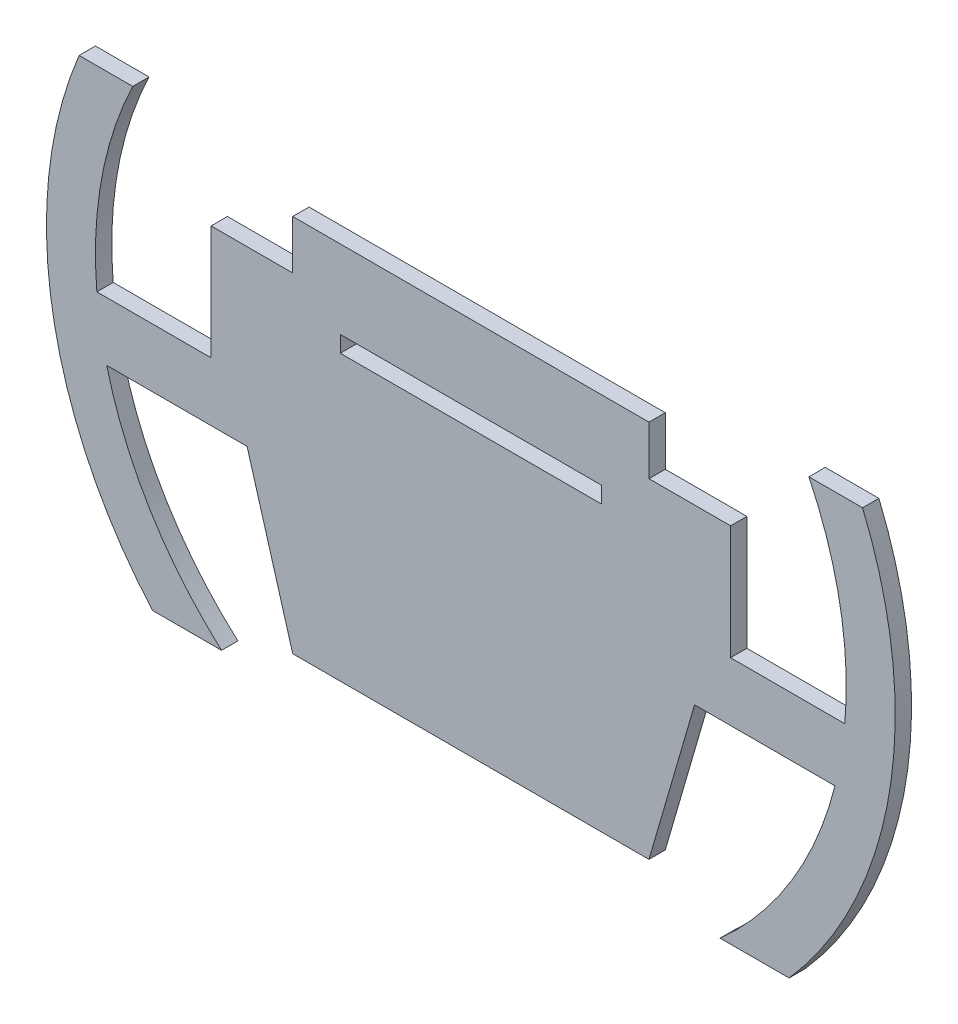
ISO-10303-21;
HEADER;
FILE_DESCRIPTION(('STEP AP214'),'2;1');
FILE_NAME('part.step','',(''),(''),'','','');
FILE_SCHEMA(('AUTOMOTIVE_DESIGN { 1 0 10303 214 1 1 1 1 }'));
ENDSEC;
DATA;
#1=APPLICATION_CONTEXT('core data for automotive mechanical design processes');
#2=APPLICATION_PROTOCOL_DEFINITION('international standard','automotive_design',2000,#1);
#3=PRODUCT_CONTEXT('',#1,'mechanical');
#4=PRODUCT('Part','Part','',(#3));
#5=PRODUCT_RELATED_PRODUCT_CATEGORY('part','',(#4));
#6=PRODUCT_DEFINITION_FORMATION('','',#4);
#7=PRODUCT_DEFINITION_CONTEXT('part definition',#1,'design');
#8=PRODUCT_DEFINITION('design','',#6,#7);
#9=PRODUCT_DEFINITION_SHAPE('','',#8);
#10=(LENGTH_UNIT() NAMED_UNIT(*) SI_UNIT(.MILLI.,.METRE.));
#11=(NAMED_UNIT(*) PLANE_ANGLE_UNIT() SI_UNIT($,.RADIAN.));
#12=(NAMED_UNIT(*) SI_UNIT($,.STERADIAN.) SOLID_ANGLE_UNIT());
#13=UNCERTAINTY_MEASURE_WITH_UNIT(LENGTH_MEASURE(1.E-05),#10,'distance_accuracy_value','');
#14=(GEOMETRIC_REPRESENTATION_CONTEXT(3) GLOBAL_UNCERTAINTY_ASSIGNED_CONTEXT((#13)) GLOBAL_UNIT_ASSIGNED_CONTEXT((#10,
#11,#12)) REPRESENTATION_CONTEXT('',''));
#15=CARTESIAN_POINT('',(0.,0.,0.));
#16=DIRECTION('',(0.,0.,1.));
#17=DIRECTION('',(1.,0.,0.));
#18=AXIS2_PLACEMENT_3D('',#15,#16,#17);
#19=CARTESIAN_POINT('',(0.,0.,5.));
#20=DIRECTION('',(0.,0.,1.));
#21=DIRECTION('',(1.,0.,0.));
#22=AXIS2_PLACEMENT_3D('',#19,#20,#21);
#23=PLANE('',#22);
#24=DIRECTION('',(0.,1.,0.));
#25=VECTOR('',#24,1.);
#26=CARTESIAN_POINT('',(40.,16.,5.));
#27=LINE('',#26,#25);
#28=CARTESIAN_POINT('',(40.,11.,5.));
#29=VERTEX_POINT('',#28);
#30=CARTESIAN_POINT('',(40.,16.,5.));
#31=VERTEX_POINT('',#30);
#32=EDGE_CURVE('E53',#29,#31,#27,.T.);
#33=ORIENTED_EDGE('',*,*,#32,.F.);
#34=DIRECTION('',(1.,0.,0.));
#35=VECTOR('',#34,1.);
#36=CARTESIAN_POINT('',(-40.,11.,5.));
#37=LINE('',#36,#35);
#38=CARTESIAN_POINT('',(-40.,11.,5.));
#39=VERTEX_POINT('',#38);
#40=EDGE_CURVE('E240',#39,#29,#37,.T.);
#41=ORIENTED_EDGE('',*,*,#40,.F.);
#42=DIRECTION('',(0.,-1.,0.));
#43=VECTOR('',#42,1.);
#44=CARTESIAN_POINT('',(-40.,16.,5.));
#45=LINE('',#44,#43);
#46=CARTESIAN_POINT('',(-40.,16.,5.));
#47=VERTEX_POINT('',#46);
#48=EDGE_CURVE('E243',#47,#39,#45,.T.);
#49=ORIENTED_EDGE('',*,*,#48,.F.);
#50=DIRECTION('',(-1.,0.,0.));
#51=VECTOR('',#50,1.);
#52=CARTESIAN_POINT('',(-40.,16.,5.));
#53=LINE('',#52,#51);
#54=EDGE_CURVE('E249',#31,#47,#53,.T.);
#55=ORIENTED_EDGE('',*,*,#54,.F.);
#56=EDGE_LOOP('',(#33,#41,#49,#55));
#57=FACE_BOUND('',#56,.T.);
#58=DIRECTION('',(0.,1.,0.));
#59=VECTOR('',#58,1.);
#60=CARTESIAN_POINT('',(-79.564392373896,-10.,5.));
#61=LINE('',#60,#59);
#62=CARTESIAN_POINT('',(-79.564392373896,-10.,5.));
#63=VERTEX_POINT('',#62);
#64=CARTESIAN_POINT('',(-79.564392373896,25.,5.));
#65=VERTEX_POINT('',#64);
#66=EDGE_CURVE('E263',#63,#65,#61,.T.);
#67=ORIENTED_EDGE('',*,*,#66,.F.);
#68=DIRECTION('',(1.,0.,0.));
#69=VECTOR('',#68,1.);
#70=CARTESIAN_POINT('',(0.,-10.,5.));
#71=LINE('',#70,#69);
#72=CARTESIAN_POINT('',(-114.564392373896,-10.,5.));
#73=VERTEX_POINT('',#72);
#74=EDGE_CURVE('E323',#73,#63,#71,.T.);
#75=ORIENTED_EDGE('',*,*,#74,.F.);
#76=CARTESIAN_POINT('',(0.,0.,5.));
#77=DIRECTION('',(0.,0.,1.));
#78=DIRECTION('',(1.,0.,0.));
#79=AXIS2_PLACEMENT_3D('',#76,#77,#78);
#80=CIRCLE('',#79,115.);
#81=CARTESIAN_POINT('',(-103.56157588604,50.,5.));
#82=VERTEX_POINT('',#81);
#83=EDGE_CURVE('E325',#82,#73,#80,.T.);
#84=ORIENTED_EDGE('',*,*,#83,.F.);
#85=DIRECTION('',(-1.,0.,0.));
#86=VECTOR('',#85,1.);
#87=CARTESIAN_POINT('',(0.,50.,5.));
#88=LINE('',#87,#86);
#89=CARTESIAN_POINT('',(-120.,50.,5.));
#90=VERTEX_POINT('',#89);
#91=EDGE_CURVE('E328',#82,#90,#88,.T.);
#92=ORIENTED_EDGE('',*,*,#91,.T.);
#93=CARTESIAN_POINT('',(0.,0.,5.));
#94=DIRECTION('',(0.,0.,1.));
#95=DIRECTION('',(1.,0.,0.));
#96=AXIS2_PLACEMENT_3D('',#93,#94,#95);
#97=CIRCLE('',#96,130.);
#98=CARTESIAN_POINT('',(-97.4884608556315,-86.,5.));
#99=VERTEX_POINT('',#98);
#100=EDGE_CURVE('E330',#90,#99,#97,.T.);
#101=ORIENTED_EDGE('',*,*,#100,.T.);
#102=DIRECTION('',(-1.,0.,0.));
#103=VECTOR('',#102,1.);
#104=CARTESIAN_POINT('',(0.,-86.,5.));
#105=LINE('',#104,#103);
#106=CARTESIAN_POINT('',(-76.3478879865056,-86.,5.));
#107=VERTEX_POINT('',#106);
#108=EDGE_CURVE('E332',#107,#99,#105,.T.);
#109=ORIENTED_EDGE('',*,*,#108,.F.);
#110=CARTESIAN_POINT('',(0.,0.,5.));
#111=DIRECTION('',(0.,0.,1.));
#112=DIRECTION('',(1.,0.,0.));
#113=AXIS2_PLACEMENT_3D('',#110,#111,#112);
#114=CIRCLE('',#113,115.);
#115=CARTESIAN_POINT('',(-111.539230766578,-28.,5.));
#116=VERTEX_POINT('',#115);
#117=EDGE_CURVE('E281',#116,#107,#114,.T.);
#118=ORIENTED_EDGE('',*,*,#117,.F.);
#119=DIRECTION('',(1.,0.,0.));
#120=VECTOR('',#119,1.);
#121=CARTESIAN_POINT('',(0.,-28.,5.));
#122=LINE('',#121,#120);
#123=CARTESIAN_POINT('',(-68.5392307665783,-28.,5.));
#124=VERTEX_POINT('',#123);
#125=EDGE_CURVE('E284',#116,#124,#122,.T.);
#126=ORIENTED_EDGE('',*,*,#125,.T.);
#127=DIRECTION('',(0.279536123266532,-0.960135175789908,0.));
#128=VECTOR('',#127,1.);
#129=CARTESIAN_POINT('',(-70.6985338444657,-20.5833455224164,5.));
#130=LINE('',#129,#128);
#131=CARTESIAN_POINT('',(-54.564392373896,-76.,5.));
#132=VERTEX_POINT('',#131);
#133=EDGE_CURVE('E287',#124,#132,#130,.T.);
#134=ORIENTED_EDGE('',*,*,#133,.T.);
#135=DIRECTION('',(1.,0.,0.));
#136=VECTOR('',#135,1.);
#137=CARTESIAN_POINT('',(0.,-76.,5.));
#138=LINE('',#137,#136);
#139=CARTESIAN_POINT('',(54.564392373896,-76.,5.));
#140=VERTEX_POINT('',#139);
#141=EDGE_CURVE('E289',#132,#140,#138,.T.);
#142=ORIENTED_EDGE('',*,*,#141,.T.);
#143=DIRECTION('',(-0.279536123266532,-0.960135175789908,0.));
#144=VECTOR('',#143,1.);
#145=CARTESIAN_POINT('',(70.6985338444657,-20.5833455224164,5.));
#146=LINE('',#145,#144);
#147=CARTESIAN_POINT('',(68.5392307665783,-28.,5.));
#148=VERTEX_POINT('',#147);
#149=EDGE_CURVE('E291',#148,#140,#146,.T.);
#150=ORIENTED_EDGE('',*,*,#149,.F.);
#151=DIRECTION('',(-1.,0.,0.));
#152=VECTOR('',#151,1.);
#153=CARTESIAN_POINT('',(0.,-28.,5.));
#154=LINE('',#153,#152);
#155=CARTESIAN_POINT('',(111.539230766578,-28.,5.));
#156=VERTEX_POINT('',#155);
#157=EDGE_CURVE('E294',#156,#148,#154,.T.);
#158=ORIENTED_EDGE('',*,*,#157,.F.);
#159=CARTESIAN_POINT('',(0.,0.,5.));
#160=DIRECTION('',(0.,0.,1.));
#161=DIRECTION('',(1.,0.,0.));
#162=AXIS2_PLACEMENT_3D('',#159,#160,#161);
#163=CIRCLE('',#162,115.);
#164=CARTESIAN_POINT('',(76.3478879865056,-86.,5.));
#165=VERTEX_POINT('',#164);
#166=EDGE_CURVE('E297',#156,#165,#163,.F.);
#167=ORIENTED_EDGE('',*,*,#166,.T.);
#168=DIRECTION('',(1.,0.,0.));
#169=VECTOR('',#168,1.);
#170=CARTESIAN_POINT('',(0.,-86.,5.));
#171=LINE('',#170,#169);
#172=CARTESIAN_POINT('',(97.4884608556315,-86.,5.));
#173=VERTEX_POINT('',#172);
#174=EDGE_CURVE('E299',#165,#173,#171,.T.);
#175=ORIENTED_EDGE('',*,*,#174,.T.);
#176=CARTESIAN_POINT('',(0.,0.,5.));
#177=DIRECTION('',(0.,0.,1.));
#178=DIRECTION('',(1.,0.,0.));
#179=AXIS2_PLACEMENT_3D('',#176,#177,#178);
#180=CIRCLE('',#179,130.);
#181=CARTESIAN_POINT('',(120.,50.,5.));
#182=VERTEX_POINT('',#181);
#183=EDGE_CURVE('E301',#182,#173,#180,.F.);
#184=ORIENTED_EDGE('',*,*,#183,.F.);
#185=DIRECTION('',(1.,0.,0.));
#186=VECTOR('',#185,1.);
#187=CARTESIAN_POINT('',(0.,50.,5.));
#188=LINE('',#187,#186);
#189=CARTESIAN_POINT('',(103.56157588604,50.,5.));
#190=VERTEX_POINT('',#189);
#191=EDGE_CURVE('E304',#190,#182,#188,.T.);
#192=ORIENTED_EDGE('',*,*,#191,.F.);
#193=CARTESIAN_POINT('',(0.,0.,5.));
#194=DIRECTION('',(0.,0.,1.));
#195=DIRECTION('',(1.,0.,0.));
#196=AXIS2_PLACEMENT_3D('',#193,#194,#195);
#197=CIRCLE('',#196,115.);
#198=CARTESIAN_POINT('',(114.564392373896,-10.,5.));
#199=VERTEX_POINT('',#198);
#200=EDGE_CURVE('E307',#190,#199,#197,.F.);
#201=ORIENTED_EDGE('',*,*,#200,.T.);
#202=DIRECTION('',(-1.,0.,0.));
#203=VECTOR('',#202,1.);
#204=CARTESIAN_POINT('',(0.,-10.,5.));
#205=LINE('',#204,#203);
#206=CARTESIAN_POINT('',(79.564392373896,-10.,5.));
#207=VERTEX_POINT('',#206);
#208=EDGE_CURVE('E309',#199,#207,#205,.T.);
#209=ORIENTED_EDGE('',*,*,#208,.T.);
#210=DIRECTION('',(0.,-1.,0.));
#211=VECTOR('',#210,1.);
#212=CARTESIAN_POINT('',(79.564392373896,-10.,5.));
#213=LINE('',#212,#211);
#214=CARTESIAN_POINT('',(79.564392373896,25.,5.));
#215=VERTEX_POINT('',#214);
#216=EDGE_CURVE('E265',#215,#207,#213,.T.);
#217=ORIENTED_EDGE('',*,*,#216,.F.);
#218=DIRECTION('',(-1.,0.,0.));
#219=VECTOR('',#218,1.);
#220=CARTESIAN_POINT('',(0.,25.,5.));
#221=LINE('',#220,#219);
#222=CARTESIAN_POINT('',(54.564392373896,25.,5.));
#223=VERTEX_POINT('',#222);
#224=EDGE_CURVE('E311',#215,#223,#221,.T.);
#225=ORIENTED_EDGE('',*,*,#224,.T.);
#226=DIRECTION('',(0.,1.,0.));
#227=VECTOR('',#226,1.);
#228=CARTESIAN_POINT('',(54.564392373896,0.,5.));
#229=LINE('',#228,#227);
#230=CARTESIAN_POINT('',(54.564392373896,40.,5.));
#231=VERTEX_POINT('',#230);
#232=EDGE_CURVE('E313',#223,#231,#229,.T.);
#233=ORIENTED_EDGE('',*,*,#232,.T.);
#234=DIRECTION('',(1.,0.,0.));
#235=VECTOR('',#234,1.);
#236=CARTESIAN_POINT('',(0.,40.,5.));
#237=LINE('',#236,#235);
#238=CARTESIAN_POINT('',(-54.564392373896,40.,5.));
#239=VERTEX_POINT('',#238);
#240=EDGE_CURVE('E315',#239,#231,#237,.T.);
#241=ORIENTED_EDGE('',*,*,#240,.F.);
#242=DIRECTION('',(0.,1.,0.));
#243=VECTOR('',#242,1.);
#244=CARTESIAN_POINT('',(-54.564392373896,0.,5.));
#245=LINE('',#244,#243);
#246=CARTESIAN_POINT('',(-54.564392373896,25.,5.));
#247=VERTEX_POINT('',#246);
#248=EDGE_CURVE('E318',#247,#239,#245,.T.);
#249=ORIENTED_EDGE('',*,*,#248,.F.);
#250=DIRECTION('',(1.,0.,0.));
#251=VECTOR('',#250,1.);
#252=CARTESIAN_POINT('',(0.,25.,5.));
#253=LINE('',#252,#251);
#254=EDGE_CURVE('E321',#65,#247,#253,.T.);
#255=ORIENTED_EDGE('',*,*,#254,.F.);
#256=EDGE_LOOP('',(#67,#75,#84,#92,#101,#109,#118,#126,#134,#142,#150,#158,#167,#175,#184,#192,
#201,#209,#217,#225,#233,#241,#249,#255));
#257=FACE_BOUND('',#256,.T.);
#258=ADVANCED_FACE('F38',(#57,#257),#23,.T.);
#259=CARTESIAN_POINT('',(0.,0.,0.));
#260=DIRECTION('',(0.,0.,1.));
#261=DIRECTION('',(1.,0.,0.));
#262=AXIS2_PLACEMENT_3D('',#259,#260,#261);
#263=PLANE('',#262);
#264=DIRECTION('',(1.,0.,0.));
#265=VECTOR('',#264,1.);
#266=CARTESIAN_POINT('',(-40.,11.,0.));
#267=LINE('',#266,#265);
#268=CARTESIAN_POINT('',(-40.,11.,0.));
#269=VERTEX_POINT('',#268);
#270=CARTESIAN_POINT('',(40.,11.,0.));
#271=VERTEX_POINT('',#270);
#272=EDGE_CURVE('E230',#269,#271,#267,.T.);
#273=ORIENTED_EDGE('',*,*,#272,.T.);
#274=DIRECTION('',(0.,1.,0.));
#275=VECTOR('',#274,1.);
#276=CARTESIAN_POINT('',(40.,16.,0.));
#277=LINE('',#276,#275);
#278=CARTESIAN_POINT('',(40.,16.,0.));
#279=VERTEX_POINT('',#278);
#280=EDGE_CURVE('E224',#271,#279,#277,.T.);
#281=ORIENTED_EDGE('',*,*,#280,.T.);
#282=DIRECTION('',(-1.,0.,0.));
#283=VECTOR('',#282,1.);
#284=CARTESIAN_POINT('',(-40.,16.,0.));
#285=LINE('',#284,#283);
#286=CARTESIAN_POINT('',(-40.,16.,0.));
#287=VERTEX_POINT('',#286);
#288=EDGE_CURVE('E233',#279,#287,#285,.T.);
#289=ORIENTED_EDGE('',*,*,#288,.T.);
#290=DIRECTION('',(0.,-1.,0.));
#291=VECTOR('',#290,1.);
#292=CARTESIAN_POINT('',(-40.,16.,0.));
#293=LINE('',#292,#291);
#294=EDGE_CURVE('E61',#287,#269,#293,.T.);
#295=ORIENTED_EDGE('',*,*,#294,.T.);
#296=EDGE_LOOP('',(#273,#281,#289,#295));
#297=FACE_BOUND('',#296,.T.);
#298=DIRECTION('',(1.,0.,0.));
#299=VECTOR('',#298,1.);
#300=CARTESIAN_POINT('',(0.,-10.,0.));
#301=LINE('',#300,#299);
#302=CARTESIAN_POINT('',(-114.564392373896,-10.,0.));
#303=VERTEX_POINT('',#302);
#304=CARTESIAN_POINT('',(-79.564392373896,-10.,0.));
#305=VERTEX_POINT('',#304);
#306=EDGE_CURVE('E379',#303,#305,#301,.T.);
#307=ORIENTED_EDGE('',*,*,#306,.T.);
#308=DIRECTION('',(0.,1.,0.));
#309=VECTOR('',#308,1.);
#310=CARTESIAN_POINT('',(-79.564392373896,-10.,0.));
#311=LINE('',#310,#309);
#312=CARTESIAN_POINT('',(-79.564392373896,25.,0.));
#313=VERTEX_POINT('',#312);
#314=EDGE_CURVE('E259',#305,#313,#311,.T.);
#315=ORIENTED_EDGE('',*,*,#314,.T.);
#316=DIRECTION('',(1.,0.,0.));
#317=VECTOR('',#316,1.);
#318=CARTESIAN_POINT('',(0.,25.,0.));
#319=LINE('',#318,#317);
#320=CARTESIAN_POINT('',(-54.564392373896,25.,0.));
#321=VERTEX_POINT('',#320);
#322=EDGE_CURVE('E377',#313,#321,#319,.T.);
#323=ORIENTED_EDGE('',*,*,#322,.T.);
#324=DIRECTION('',(0.,1.,0.));
#325=VECTOR('',#324,1.);
#326=CARTESIAN_POINT('',(-54.564392373896,0.,0.));
#327=LINE('',#326,#325);
#328=CARTESIAN_POINT('',(-54.564392373896,40.,0.));
#329=VERTEX_POINT('',#328);
#330=EDGE_CURVE('E374',#321,#329,#327,.T.);
#331=ORIENTED_EDGE('',*,*,#330,.T.);
#332=DIRECTION('',(1.,0.,0.));
#333=VECTOR('',#332,1.);
#334=CARTESIAN_POINT('',(0.,40.,0.));
#335=LINE('',#334,#333);
#336=CARTESIAN_POINT('',(54.564392373896,40.,0.));
#337=VERTEX_POINT('',#336);
#338=EDGE_CURVE('E371',#329,#337,#335,.T.);
#339=ORIENTED_EDGE('',*,*,#338,.T.);
#340=DIRECTION('',(0.,1.,0.));
#341=VECTOR('',#340,1.);
#342=CARTESIAN_POINT('',(54.564392373896,0.,0.));
#343=LINE('',#342,#341);
#344=CARTESIAN_POINT('',(54.564392373896,25.,0.));
#345=VERTEX_POINT('',#344);
#346=EDGE_CURVE('E368',#345,#337,#343,.T.);
#347=ORIENTED_EDGE('',*,*,#346,.F.);
#348=DIRECTION('',(-1.,0.,0.));
#349=VECTOR('',#348,1.);
#350=CARTESIAN_POINT('',(0.,25.,0.));
#351=LINE('',#350,#349);
#352=CARTESIAN_POINT('',(79.564392373896,25.,0.));
#353=VERTEX_POINT('',#352);
#354=EDGE_CURVE('E366',#353,#345,#351,.T.);
#355=ORIENTED_EDGE('',*,*,#354,.F.);
#356=DIRECTION('',(0.,-1.,0.));
#357=VECTOR('',#356,1.);
#358=CARTESIAN_POINT('',(79.564392373896,-10.,0.));
#359=LINE('',#358,#357);
#360=CARTESIAN_POINT('',(79.564392373896,-10.,0.));
#361=VERTEX_POINT('',#360);
#362=EDGE_CURVE('E271',#353,#361,#359,.T.);
#363=ORIENTED_EDGE('',*,*,#362,.T.);
#364=DIRECTION('',(-1.,0.,0.));
#365=VECTOR('',#364,1.);
#366=CARTESIAN_POINT('',(0.,-10.,0.));
#367=LINE('',#366,#365);
#368=CARTESIAN_POINT('',(114.564392373896,-10.,0.));
#369=VERTEX_POINT('',#368);
#370=EDGE_CURVE('E364',#369,#361,#367,.T.);
#371=ORIENTED_EDGE('',*,*,#370,.F.);
#372=CARTESIAN_POINT('',(0.,0.,0.));
#373=DIRECTION('',(0.,0.,1.));
#374=DIRECTION('',(1.,0.,0.));
#375=AXIS2_PLACEMENT_3D('',#372,#373,#374);
#376=CIRCLE('',#375,115.);
#377=CARTESIAN_POINT('',(103.56157588604,50.,0.));
#378=VERTEX_POINT('',#377);
#379=EDGE_CURVE('E362',#378,#369,#376,.F.);
#380=ORIENTED_EDGE('',*,*,#379,.F.);
#381=DIRECTION('',(1.,0.,0.));
#382=VECTOR('',#381,1.);
#383=CARTESIAN_POINT('',(0.,50.,0.));
#384=LINE('',#383,#382);
#385=CARTESIAN_POINT('',(120.,50.,0.));
#386=VERTEX_POINT('',#385);
#387=EDGE_CURVE('E359',#378,#386,#384,.T.);
#388=ORIENTED_EDGE('',*,*,#387,.T.);
#389=CARTESIAN_POINT('',(0.,0.,0.));
#390=DIRECTION('',(0.,0.,1.));
#391=DIRECTION('',(1.,0.,0.));
#392=AXIS2_PLACEMENT_3D('',#389,#390,#391);
#393=CIRCLE('',#392,130.);
#394=CARTESIAN_POINT('',(97.4884608556315,-86.,0.));
#395=VERTEX_POINT('',#394);
#396=EDGE_CURVE('E356',#386,#395,#393,.F.);
#397=ORIENTED_EDGE('',*,*,#396,.T.);
#398=DIRECTION('',(1.,0.,0.));
#399=VECTOR('',#398,1.);
#400=CARTESIAN_POINT('',(0.,-86.,0.));
#401=LINE('',#400,#399);
#402=CARTESIAN_POINT('',(76.3478879865056,-86.,0.));
#403=VERTEX_POINT('',#402);
#404=EDGE_CURVE('E353',#403,#395,#401,.T.);
#405=ORIENTED_EDGE('',*,*,#404,.F.);
#406=CARTESIAN_POINT('',(0.,0.,0.));
#407=DIRECTION('',(0.,0.,1.));
#408=DIRECTION('',(1.,0.,0.));
#409=AXIS2_PLACEMENT_3D('',#406,#407,#408);
#410=CIRCLE('',#409,115.);
#411=CARTESIAN_POINT('',(111.539230766578,-28.,0.));
#412=VERTEX_POINT('',#411);
#413=EDGE_CURVE('E351',#412,#403,#410,.F.);
#414=ORIENTED_EDGE('',*,*,#413,.F.);
#415=DIRECTION('',(-1.,0.,0.));
#416=VECTOR('',#415,1.);
#417=CARTESIAN_POINT('',(0.,-28.,0.));
#418=LINE('',#417,#416);
#419=CARTESIAN_POINT('',(68.5392307665783,-28.,0.));
#420=VERTEX_POINT('',#419);
#421=EDGE_CURVE('E348',#412,#420,#418,.T.);
#422=ORIENTED_EDGE('',*,*,#421,.T.);
#423=DIRECTION('',(-0.279536123266532,-0.960135175789908,0.));
#424=VECTOR('',#423,1.);
#425=CARTESIAN_POINT('',(70.6985338444657,-20.5833455224164,0.));
#426=LINE('',#425,#424);
#427=CARTESIAN_POINT('',(54.564392373896,-76.,0.));
#428=VERTEX_POINT('',#427);
#429=EDGE_CURVE('E345',#420,#428,#426,.T.);
#430=ORIENTED_EDGE('',*,*,#429,.T.);
#431=DIRECTION('',(1.,0.,0.));
#432=VECTOR('',#431,1.);
#433=CARTESIAN_POINT('',(0.,-76.,0.));
#434=LINE('',#433,#432);
#435=CARTESIAN_POINT('',(-54.564392373896,-76.,0.));
#436=VERTEX_POINT('',#435);
#437=EDGE_CURVE('E342',#436,#428,#434,.T.);
#438=ORIENTED_EDGE('',*,*,#437,.F.);
#439=DIRECTION('',(0.279536123266532,-0.960135175789908,0.));
#440=VECTOR('',#439,1.);
#441=CARTESIAN_POINT('',(-70.6985338444657,-20.5833455224164,0.));
#442=LINE('',#441,#440);
#443=CARTESIAN_POINT('',(-68.5392307665783,-28.,0.));
#444=VERTEX_POINT('',#443);
#445=EDGE_CURVE('E340',#444,#436,#442,.T.);
#446=ORIENTED_EDGE('',*,*,#445,.F.);
#447=DIRECTION('',(1.,0.,0.));
#448=VECTOR('',#447,1.);
#449=CARTESIAN_POINT('',(0.,-28.,0.));
#450=LINE('',#449,#448);
#451=CARTESIAN_POINT('',(-111.539230766578,-28.,0.));
#452=VERTEX_POINT('',#451);
#453=EDGE_CURVE('E338',#452,#444,#450,.T.);
#454=ORIENTED_EDGE('',*,*,#453,.F.);
#455=CARTESIAN_POINT('',(0.,0.,0.));
#456=DIRECTION('',(0.,0.,1.));
#457=DIRECTION('',(1.,0.,0.));
#458=AXIS2_PLACEMENT_3D('',#455,#456,#457);
#459=CIRCLE('',#458,115.);
#460=CARTESIAN_POINT('',(-76.3478879865056,-86.,0.));
#461=VERTEX_POINT('',#460);
#462=EDGE_CURVE('E280',#452,#461,#459,.T.);
#463=ORIENTED_EDGE('',*,*,#462,.T.);
#464=DIRECTION('',(-1.,0.,0.));
#465=VECTOR('',#464,1.);
#466=CARTESIAN_POINT('',(0.,-86.,0.));
#467=LINE('',#466,#465);
#468=CARTESIAN_POINT('',(-97.4884608556315,-86.,0.));
#469=VERTEX_POINT('',#468);
#470=EDGE_CURVE('E285',#461,#469,#467,.T.);
#471=ORIENTED_EDGE('',*,*,#470,.T.);
#472=CARTESIAN_POINT('',(0.,0.,0.));
#473=DIRECTION('',(0.,0.,1.));
#474=DIRECTION('',(1.,0.,0.));
#475=AXIS2_PLACEMENT_3D('',#472,#473,#474);
#476=CIRCLE('',#475,130.);
#477=CARTESIAN_POINT('',(-120.,50.,0.));
#478=VERTEX_POINT('',#477);
#479=EDGE_CURVE('E386',#478,#469,#476,.T.);
#480=ORIENTED_EDGE('',*,*,#479,.F.);
#481=DIRECTION('',(-1.,0.,0.));
#482=VECTOR('',#481,1.);
#483=CARTESIAN_POINT('',(0.,50.,0.));
#484=LINE('',#483,#482);
#485=CARTESIAN_POINT('',(-103.56157588604,50.,0.));
#486=VERTEX_POINT('',#485);
#487=EDGE_CURVE('E384',#486,#478,#484,.T.);
#488=ORIENTED_EDGE('',*,*,#487,.F.);
#489=CARTESIAN_POINT('',(0.,0.,0.));
#490=DIRECTION('',(0.,0.,1.));
#491=DIRECTION('',(1.,0.,0.));
#492=AXIS2_PLACEMENT_3D('',#489,#490,#491);
#493=CIRCLE('',#492,115.);
#494=EDGE_CURVE('E381',#486,#303,#493,.T.);
#495=ORIENTED_EDGE('',*,*,#494,.T.);
#496=EDGE_LOOP('',(#307,#315,#323,#331,#339,#347,#355,#363,#371,#380,#388,#397,#405,#414,#422,
#430,#438,#446,#454,#463,#471,#480,#488,#495));
#497=FACE_BOUND('',#496,.T.);
#498=ADVANCED_FACE('F237',(#297,#497),#263,.F.);
#499=CARTESIAN_POINT('',(0.,25.,5.));
#500=DIRECTION('',(0.,-1.,0.));
#501=DIRECTION('',(0.,0.,-1.));
#502=AXIS2_PLACEMENT_3D('',#499,#500,#501);
#503=PLANE('',#502);
#504=DIRECTION('',(0.,0.,1.));
#505=VECTOR('',#504,1.);
#506=CARTESIAN_POINT('',(79.564392373896,25.,0.));
#507=LINE('',#506,#505);
#508=EDGE_CURVE('E278',#353,#215,#507,.T.);
#509=ORIENTED_EDGE('',*,*,#508,.F.);
#510=ORIENTED_EDGE('',*,*,#354,.T.);
#511=DIRECTION('',(0.,0.,-1.));
#512=VECTOR('',#511,1.);
#513=CARTESIAN_POINT('',(54.564392373896,25.,5.));
#514=LINE('',#513,#512);
#515=EDGE_CURVE('E408',#223,#345,#514,.T.);
#516=ORIENTED_EDGE('',*,*,#515,.F.);
#517=ORIENTED_EDGE('',*,*,#224,.F.);
#518=EDGE_LOOP('',(#509,#510,#516,#517));
#519=FACE_BOUND('',#518,.T.);
#520=ADVANCED_FACE('F502',(#519),#503,.F.);
#521=CARTESIAN_POINT('',(0.,0.,5.));
#522=DIRECTION('',(0.,0.,-1.));
#523=DIRECTION('',(-1.,0.,0.));
#524=AXIS2_PLACEMENT_3D('',#521,#522,#523);
#525=CYLINDRICAL_SURFACE('',#524,115.);
#526=ORIENTED_EDGE('',*,*,#462,.F.);
#527=DIRECTION('',(0.,0.,-1.));
#528=VECTOR('',#527,1.);
#529=CARTESIAN_POINT('',(-111.539230766578,-28.,5.));
#530=LINE('',#529,#528);
#531=EDGE_CURVE('E11',#116,#452,#530,.T.);
#532=ORIENTED_EDGE('',*,*,#531,.F.);
#533=ORIENTED_EDGE('',*,*,#117,.T.);
#534=DIRECTION('',(0.,0.,-1.));
#535=VECTOR('',#534,1.);
#536=CARTESIAN_POINT('',(-76.3478879865056,-86.,5.));
#537=LINE('',#536,#535);
#538=EDGE_CURVE('E335',#107,#461,#537,.T.);
#539=ORIENTED_EDGE('',*,*,#538,.T.);
#540=EDGE_LOOP('',(#526,#532,#533,#539));
#541=FACE_BOUND('',#540,.T.);
#542=ADVANCED_FACE('F40',(#541),#525,.F.);
#543=CARTESIAN_POINT('',(0.,-28.,5.));
#544=DIRECTION('',(0.,1.,0.));
#545=DIRECTION('',(-1.,0.,0.));
#546=AXIS2_PLACEMENT_3D('',#543,#544,#545);
#547=PLANE('',#546);
#548=ORIENTED_EDGE('',*,*,#453,.T.);
#549=DIRECTION('',(0.,0.,-1.));
#550=VECTOR('',#549,1.);
#551=CARTESIAN_POINT('',(-68.5392307665783,-28.,5.));
#552=LINE('',#551,#550);
#553=EDGE_CURVE('E46',#124,#444,#552,.T.);
#554=ORIENTED_EDGE('',*,*,#553,.F.);
#555=ORIENTED_EDGE('',*,*,#125,.F.);
#556=ORIENTED_EDGE('',*,*,#531,.T.);
#557=EDGE_LOOP('',(#548,#554,#555,#556));
#558=FACE_BOUND('',#557,.T.);
#559=ADVANCED_FACE('F454',(#558),#547,.F.);
#560=CARTESIAN_POINT('',(-70.6985338444657,-20.5833455224164,5.));
#561=DIRECTION('',(0.960135175789908,0.279536123266532,0.));
#562=DIRECTION('',(-0.279536123266532,0.960135175789908,0.));
#563=AXIS2_PLACEMENT_3D('',#560,#561,#562);
#564=PLANE('',#563);
#565=ORIENTED_EDGE('',*,*,#445,.T.);
#566=DIRECTION('',(0.,0.,-1.));
#567=VECTOR('',#566,1.);
#568=CARTESIAN_POINT('',(-54.564392373896,-76.,5.));
#569=LINE('',#568,#567);
#570=EDGE_CURVE('E429',#132,#436,#569,.T.);
#571=ORIENTED_EDGE('',*,*,#570,.F.);
#572=ORIENTED_EDGE('',*,*,#133,.F.);
#573=ORIENTED_EDGE('',*,*,#553,.T.);
#574=EDGE_LOOP('',(#565,#571,#572,#573));
#575=FACE_BOUND('',#574,.T.);
#576=ADVANCED_FACE('F436',(#575),#564,.F.);
#577=CARTESIAN_POINT('',(0.,-76.,5.));
#578=DIRECTION('',(0.,1.,0.));
#579=DIRECTION('',(-1.,0.,0.));
#580=AXIS2_PLACEMENT_3D('',#577,#578,#579);
#581=PLANE('',#580);
#582=ORIENTED_EDGE('',*,*,#437,.T.);
#583=DIRECTION('',(0.,0.,-1.));
#584=VECTOR('',#583,1.);
#585=CARTESIAN_POINT('',(54.564392373896,-76.,5.));
#586=LINE('',#585,#584);
#587=EDGE_CURVE('E427',#140,#428,#586,.T.);
#588=ORIENTED_EDGE('',*,*,#587,.F.);
#589=ORIENTED_EDGE('',*,*,#141,.F.);
#590=ORIENTED_EDGE('',*,*,#570,.T.);
#591=EDGE_LOOP('',(#582,#588,#589,#590));
#592=FACE_BOUND('',#591,.T.);
#593=ADVANCED_FACE('F446',(#592),#581,.F.);
#594=CARTESIAN_POINT('',(70.6985338444657,-20.5833455224164,5.));
#595=DIRECTION('',(0.960135175789908,-0.279536123266532,0.));
#596=DIRECTION('',(0.279536123266532,0.960135175789908,0.));
#597=AXIS2_PLACEMENT_3D('',#594,#595,#596);
#598=PLANE('',#597);
#599=ORIENTED_EDGE('',*,*,#429,.F.);
#600=DIRECTION('',(0.,0.,-1.));
#601=VECTOR('',#600,1.);
#602=CARTESIAN_POINT('',(68.5392307665783,-28.,5.));
#603=LINE('',#602,#601);
#604=EDGE_CURVE('E425',#148,#420,#603,.T.);
#605=ORIENTED_EDGE('',*,*,#604,.F.);
#606=ORIENTED_EDGE('',*,*,#149,.T.);
#607=ORIENTED_EDGE('',*,*,#587,.T.);
#608=EDGE_LOOP('',(#599,#605,#606,#607));
#609=FACE_BOUND('',#608,.T.);
#610=ADVANCED_FACE('F538',(#609),#598,.T.);
#611=CARTESIAN_POINT('',(0.,-28.,5.));
#612=DIRECTION('',(0.,-1.,0.));
#613=DIRECTION('',(1.,0.,0.));
#614=AXIS2_PLACEMENT_3D('',#611,#612,#613);
#615=PLANE('',#614);
#616=ORIENTED_EDGE('',*,*,#421,.F.);
#617=DIRECTION('',(0.,0.,-1.));
#618=VECTOR('',#617,1.);
#619=CARTESIAN_POINT('',(111.539230766578,-28.,5.));
#620=LINE('',#619,#618);
#621=EDGE_CURVE('E423',#156,#412,#620,.T.);
#622=ORIENTED_EDGE('',*,*,#621,.F.);
#623=ORIENTED_EDGE('',*,*,#157,.T.);
#624=ORIENTED_EDGE('',*,*,#604,.T.);
#625=EDGE_LOOP('',(#616,#622,#623,#624));
#626=FACE_BOUND('',#625,.T.);
#627=ADVANCED_FACE('F536',(#626),#615,.T.);
#628=CARTESIAN_POINT('',(0.,0.,5.));
#629=DIRECTION('',(0.,0.,-1.));
#630=DIRECTION('',(-1.,0.,0.));
#631=AXIS2_PLACEMENT_3D('',#628,#629,#630);
#632=CYLINDRICAL_SURFACE('',#631,115.);
#633=ORIENTED_EDGE('',*,*,#413,.T.);
#634=DIRECTION('',(0.,0.,-1.));
#635=VECTOR('',#634,1.);
#636=CARTESIAN_POINT('',(76.3478879865056,-86.,5.));
#637=LINE('',#636,#635);
#638=EDGE_CURVE('E420',#165,#403,#637,.T.);
#639=ORIENTED_EDGE('',*,*,#638,.F.);
#640=ORIENTED_EDGE('',*,*,#166,.F.);
#641=ORIENTED_EDGE('',*,*,#621,.T.);
#642=EDGE_LOOP('',(#633,#639,#640,#641));
#643=FACE_BOUND('',#642,.T.);
#644=ADVANCED_FACE('F534',(#643),#632,.F.);
#645=CARTESIAN_POINT('',(0.,-86.,5.));
#646=DIRECTION('',(0.,1.,0.));
#647=DIRECTION('',(0.,0.,1.));
#648=AXIS2_PLACEMENT_3D('',#645,#646,#647);
#649=PLANE('',#648);
#650=ORIENTED_EDGE('',*,*,#404,.T.);
#651=DIRECTION('',(0.,0.,-1.));
#652=VECTOR('',#651,1.);
#653=CARTESIAN_POINT('',(97.4884608556315,-86.,5.));
#654=LINE('',#653,#652);
#655=EDGE_CURVE('E418',#173,#395,#654,.T.);
#656=ORIENTED_EDGE('',*,*,#655,.F.);
#657=ORIENTED_EDGE('',*,*,#174,.F.);
#658=ORIENTED_EDGE('',*,*,#638,.T.);
#659=EDGE_LOOP('',(#650,#656,#657,#658));
#660=FACE_BOUND('',#659,.T.);
#661=ADVANCED_FACE('F529',(#660),#649,.F.);
#662=CARTESIAN_POINT('',(0.,0.,5.));
#663=DIRECTION('',(0.,0.,-1.));
#664=DIRECTION('',(-1.,0.,0.));
#665=AXIS2_PLACEMENT_3D('',#662,#663,#664);
#666=CYLINDRICAL_SURFACE('',#665,130.);
#667=ORIENTED_EDGE('',*,*,#396,.F.);
#668=DIRECTION('',(0.,0.,-1.));
#669=VECTOR('',#668,1.);
#670=CARTESIAN_POINT('',(120.,50.,5.));
#671=LINE('',#670,#669);
#672=EDGE_CURVE('E416',#182,#386,#671,.T.);
#673=ORIENTED_EDGE('',*,*,#672,.F.);
#674=ORIENTED_EDGE('',*,*,#183,.T.);
#675=ORIENTED_EDGE('',*,*,#655,.T.);
#676=EDGE_LOOP('',(#667,#673,#674,#675));
#677=FACE_BOUND('',#676,.T.);
#678=ADVANCED_FACE('F523',(#677),#666,.T.);
#679=CARTESIAN_POINT('',(0.,50.,5.));
#680=DIRECTION('',(0.,1.,0.));
#681=DIRECTION('',(0.,0.,1.));
#682=AXIS2_PLACEMENT_3D('',#679,#680,#681);
#683=PLANE('',#682);
#684=ORIENTED_EDGE('',*,*,#387,.F.);
#685=DIRECTION('',(0.,0.,-1.));
#686=VECTOR('',#685,1.);
#687=CARTESIAN_POINT('',(103.56157588604,50.,5.));
#688=LINE('',#687,#686);
#689=EDGE_CURVE('E414',#190,#378,#688,.T.);
#690=ORIENTED_EDGE('',*,*,#689,.F.);
#691=ORIENTED_EDGE('',*,*,#191,.T.);
#692=ORIENTED_EDGE('',*,*,#672,.T.);
#693=EDGE_LOOP('',(#684,#690,#691,#692));
#694=FACE_BOUND('',#693,.T.);
#695=ADVANCED_FACE('F519',(#694),#683,.T.);
#696=CARTESIAN_POINT('',(0.,0.,5.));
#697=DIRECTION('',(0.,0.,-1.));
#698=DIRECTION('',(-1.,0.,0.));
#699=AXIS2_PLACEMENT_3D('',#696,#697,#698);
#700=CYLINDRICAL_SURFACE('',#699,115.);
#701=ORIENTED_EDGE('',*,*,#379,.T.);
#702=DIRECTION('',(0.,0.,-1.));
#703=VECTOR('',#702,1.);
#704=CARTESIAN_POINT('',(114.564392373896,-10.,5.));
#705=LINE('',#704,#703);
#706=EDGE_CURVE('E411',#199,#369,#705,.T.);
#707=ORIENTED_EDGE('',*,*,#706,.F.);
#708=ORIENTED_EDGE('',*,*,#200,.F.);
#709=ORIENTED_EDGE('',*,*,#689,.T.);
#710=EDGE_LOOP('',(#701,#707,#708,#709));
#711=FACE_BOUND('',#710,.T.);
#712=ADVANCED_FACE('F515',(#711),#700,.F.);
#713=CARTESIAN_POINT('',(0.,-10.,5.));
#714=DIRECTION('',(0.,-1.,0.));
#715=DIRECTION('',(1.,0.,0.));
#716=AXIS2_PLACEMENT_3D('',#713,#714,#715);
#717=PLANE('',#716);
#718=ORIENTED_EDGE('',*,*,#370,.T.);
#719=DIRECTION('',(0.,0.,1.));
#720=VECTOR('',#719,1.);
#721=CARTESIAN_POINT('',(79.564392373896,-10.,0.));
#722=LINE('',#721,#720);
#723=EDGE_CURVE('E255',#361,#207,#722,.T.);
#724=ORIENTED_EDGE('',*,*,#723,.T.);
#725=ORIENTED_EDGE('',*,*,#208,.F.);
#726=ORIENTED_EDGE('',*,*,#706,.T.);
#727=EDGE_LOOP('',(#718,#724,#725,#726));
#728=FACE_BOUND('',#727,.T.);
#729=ADVANCED_FACE('F511',(#728),#717,.F.);
#730=CARTESIAN_POINT('',(54.564392373896,0.,5.));
#731=DIRECTION('',(-1.,0.,0.));
#732=DIRECTION('',(0.,0.,1.));
#733=AXIS2_PLACEMENT_3D('',#730,#731,#732);
#734=PLANE('',#733);
#735=ORIENTED_EDGE('',*,*,#346,.T.);
#736=DIRECTION('',(0.,0.,-1.));
#737=VECTOR('',#736,1.);
#738=CARTESIAN_POINT('',(54.564392373896,40.,5.));
#739=LINE('',#738,#737);
#740=EDGE_CURVE('E406',#231,#337,#739,.T.);
#741=ORIENTED_EDGE('',*,*,#740,.F.);
#742=ORIENTED_EDGE('',*,*,#232,.F.);
#743=ORIENTED_EDGE('',*,*,#515,.T.);
#744=EDGE_LOOP('',(#735,#741,#742,#743));
#745=FACE_BOUND('',#744,.T.);
#746=ADVANCED_FACE('F497',(#745),#734,.F.);
#747=CARTESIAN_POINT('',(0.,40.,5.));
#748=DIRECTION('',(0.,1.,0.));
#749=DIRECTION('',(0.,0.,1.));
#750=AXIS2_PLACEMENT_3D('',#747,#748,#749);
#751=PLANE('',#750);
#752=ORIENTED_EDGE('',*,*,#338,.F.);
#753=DIRECTION('',(0.,0.,-1.));
#754=VECTOR('',#753,1.);
#755=CARTESIAN_POINT('',(-54.564392373896,40.,5.));
#756=LINE('',#755,#754);
#757=EDGE_CURVE('E404',#239,#329,#756,.T.);
#758=ORIENTED_EDGE('',*,*,#757,.F.);
#759=ORIENTED_EDGE('',*,*,#240,.T.);
#760=ORIENTED_EDGE('',*,*,#740,.T.);
#761=EDGE_LOOP('',(#752,#758,#759,#760));
#762=FACE_BOUND('',#761,.T.);
#763=ADVANCED_FACE('F492',(#762),#751,.T.);
#764=CARTESIAN_POINT('',(-54.564392373896,0.,5.));
#765=DIRECTION('',(-1.,0.,0.));
#766=DIRECTION('',(0.,0.,1.));
#767=AXIS2_PLACEMENT_3D('',#764,#765,#766);
#768=PLANE('',#767);
#769=ORIENTED_EDGE('',*,*,#330,.F.);
#770=DIRECTION('',(0.,0.,-1.));
#771=VECTOR('',#770,1.);
#772=CARTESIAN_POINT('',(-54.564392373896,25.,5.));
#773=LINE('',#772,#771);
#774=EDGE_CURVE('E401',#247,#321,#773,.T.);
#775=ORIENTED_EDGE('',*,*,#774,.F.);
#776=ORIENTED_EDGE('',*,*,#248,.T.);
#777=ORIENTED_EDGE('',*,*,#757,.T.);
#778=EDGE_LOOP('',(#769,#775,#776,#777));
#779=FACE_BOUND('',#778,.T.);
#780=ADVANCED_FACE('F487',(#779),#768,.T.);
#781=CARTESIAN_POINT('',(0.,25.,5.));
#782=DIRECTION('',(0.,1.,0.));
#783=DIRECTION('',(0.,0.,1.));
#784=AXIS2_PLACEMENT_3D('',#781,#782,#783);
#785=PLANE('',#784);
#786=DIRECTION('',(0.,0.,1.));
#787=VECTOR('',#786,1.);
#788=CARTESIAN_POINT('',(-79.564392373896,25.,0.));
#789=LINE('',#788,#787);
#790=EDGE_CURVE('E268',#313,#65,#789,.T.);
#791=ORIENTED_EDGE('',*,*,#790,.T.);
#792=ORIENTED_EDGE('',*,*,#254,.T.);
#793=ORIENTED_EDGE('',*,*,#774,.T.);
#794=ORIENTED_EDGE('',*,*,#322,.F.);
#795=EDGE_LOOP('',(#791,#792,#793,#794));
#796=FACE_BOUND('',#795,.T.);
#797=ADVANCED_FACE('F481',(#796),#785,.T.);
#798=CARTESIAN_POINT('',(0.,-10.,5.));
#799=DIRECTION('',(0.,1.,0.));
#800=DIRECTION('',(-1.,0.,0.));
#801=AXIS2_PLACEMENT_3D('',#798,#799,#800);
#802=PLANE('',#801);
#803=ORIENTED_EDGE('',*,*,#306,.F.);
#804=DIRECTION('',(0.,0.,-1.));
#805=VECTOR('',#804,1.);
#806=CARTESIAN_POINT('',(-114.564392373896,-10.,5.));
#807=LINE('',#806,#805);
#808=EDGE_CURVE('E399',#73,#303,#807,.T.);
#809=ORIENTED_EDGE('',*,*,#808,.F.);
#810=ORIENTED_EDGE('',*,*,#74,.T.);
#811=DIRECTION('',(0.,0.,1.));
#812=VECTOR('',#811,1.);
#813=CARTESIAN_POINT('',(-79.564392373896,-10.,0.));
#814=LINE('',#813,#812);
#815=EDGE_CURVE('E262',#305,#63,#814,.T.);
#816=ORIENTED_EDGE('',*,*,#815,.F.);
#817=EDGE_LOOP('',(#803,#809,#810,#816));
#818=FACE_BOUND('',#817,.T.);
#819=ADVANCED_FACE('F476',(#818),#802,.T.);
#820=CARTESIAN_POINT('',(0.,0.,5.));
#821=DIRECTION('',(0.,0.,-1.));
#822=DIRECTION('',(-1.,0.,0.));
#823=AXIS2_PLACEMENT_3D('',#820,#821,#822);
#824=CYLINDRICAL_SURFACE('',#823,115.);
#825=ORIENTED_EDGE('',*,*,#494,.F.);
#826=DIRECTION('',(0.,0.,-1.));
#827=VECTOR('',#826,1.);
#828=CARTESIAN_POINT('',(-103.56157588604,50.,5.));
#829=LINE('',#828,#827);
#830=EDGE_CURVE('E397',#82,#486,#829,.T.);
#831=ORIENTED_EDGE('',*,*,#830,.F.);
#832=ORIENTED_EDGE('',*,*,#83,.T.);
#833=ORIENTED_EDGE('',*,*,#808,.T.);
#834=EDGE_LOOP('',(#825,#831,#832,#833));
#835=FACE_BOUND('',#834,.T.);
#836=ADVANCED_FACE('F469',(#835),#824,.F.);
#837=CARTESIAN_POINT('',(0.,50.,5.));
#838=DIRECTION('',(0.,-1.,0.));
#839=DIRECTION('',(0.,0.,-1.));
#840=AXIS2_PLACEMENT_3D('',#837,#838,#839);
#841=PLANE('',#840);
#842=ORIENTED_EDGE('',*,*,#487,.T.);
#843=DIRECTION('',(0.,0.,-1.));
#844=VECTOR('',#843,1.);
#845=CARTESIAN_POINT('',(-120.,50.,5.));
#846=LINE('',#845,#844);
#847=EDGE_CURVE('E394',#90,#478,#846,.T.);
#848=ORIENTED_EDGE('',*,*,#847,.F.);
#849=ORIENTED_EDGE('',*,*,#91,.F.);
#850=ORIENTED_EDGE('',*,*,#830,.T.);
#851=EDGE_LOOP('',(#842,#848,#849,#850));
#852=FACE_BOUND('',#851,.T.);
#853=ADVANCED_FACE('F562',(#852),#841,.F.);
#854=CARTESIAN_POINT('',(0.,0.,5.));
#855=DIRECTION('',(0.,0.,-1.));
#856=DIRECTION('',(-1.,0.,0.));
#857=AXIS2_PLACEMENT_3D('',#854,#855,#856);
#858=CYLINDRICAL_SURFACE('',#857,130.);
#859=ORIENTED_EDGE('',*,*,#479,.T.);
#860=DIRECTION('',(0.,0.,-1.));
#861=VECTOR('',#860,1.);
#862=CARTESIAN_POINT('',(-97.4884608556315,-86.,5.));
#863=LINE('',#862,#861);
#864=EDGE_CURVE('E392',#99,#469,#863,.T.);
#865=ORIENTED_EDGE('',*,*,#864,.F.);
#866=ORIENTED_EDGE('',*,*,#100,.F.);
#867=ORIENTED_EDGE('',*,*,#847,.T.);
#868=EDGE_LOOP('',(#859,#865,#866,#867));
#869=FACE_BOUND('',#868,.T.);
#870=ADVANCED_FACE('F463',(#869),#858,.T.);
#871=CARTESIAN_POINT('',(0.,-86.,5.));
#872=DIRECTION('',(0.,-1.,0.));
#873=DIRECTION('',(0.,0.,-1.));
#874=AXIS2_PLACEMENT_3D('',#871,#872,#873);
#875=PLANE('',#874);
#876=ORIENTED_EDGE('',*,*,#470,.F.);
#877=ORIENTED_EDGE('',*,*,#538,.F.);
#878=ORIENTED_EDGE('',*,*,#108,.T.);
#879=ORIENTED_EDGE('',*,*,#864,.T.);
#880=EDGE_LOOP('',(#876,#877,#878,#879));
#881=FACE_BOUND('',#880,.T.);
#882=ADVANCED_FACE('F459',(#881),#875,.T.);
#883=CARTESIAN_POINT('',(-79.564392373896,-10.,0.));
#884=DIRECTION('',(1.,0.,0.));
#885=DIRECTION('',(0.,0.,-1.));
#886=AXIS2_PLACEMENT_3D('',#883,#884,#885);
#887=PLANE('',#886);
#888=ORIENTED_EDGE('',*,*,#314,.F.);
#889=ORIENTED_EDGE('',*,*,#815,.T.);
#890=ORIENTED_EDGE('',*,*,#66,.T.);
#891=ORIENTED_EDGE('',*,*,#790,.F.);
#892=EDGE_LOOP('',(#888,#889,#890,#891));
#893=FACE_BOUND('',#892,.T.);
#894=ADVANCED_FACE('F559',(#893),#887,.F.);
#895=CARTESIAN_POINT('',(79.564392373896,-10.,0.));
#896=DIRECTION('',(-1.,0.,0.));
#897=DIRECTION('',(0.,0.,1.));
#898=AXIS2_PLACEMENT_3D('',#895,#896,#897);
#899=PLANE('',#898);
#900=ORIENTED_EDGE('',*,*,#508,.T.);
#901=ORIENTED_EDGE('',*,*,#216,.T.);
#902=ORIENTED_EDGE('',*,*,#723,.F.);
#903=ORIENTED_EDGE('',*,*,#362,.F.);
#904=EDGE_LOOP('',(#900,#901,#902,#903));
#905=FACE_BOUND('',#904,.T.);
#906=ADVANCED_FACE('F507',(#905),#899,.F.);
#907=CARTESIAN_POINT('',(40.,16.,0.));
#908=DIRECTION('',(1.,0.,0.));
#909=DIRECTION('',(0.,0.,-1.));
#910=AXIS2_PLACEMENT_3D('',#907,#908,#909);
#911=PLANE('',#910);
#912=ORIENTED_EDGE('',*,*,#32,.T.);
#913=DIRECTION('',(0.,0.,1.));
#914=VECTOR('',#913,1.);
#915=CARTESIAN_POINT('',(40.,16.,0.));
#916=LINE('',#915,#914);
#917=EDGE_CURVE('E220',#279,#31,#916,.T.);
#918=ORIENTED_EDGE('',*,*,#917,.F.);
#919=ORIENTED_EDGE('',*,*,#280,.F.);
#920=DIRECTION('',(0.,0.,1.));
#921=VECTOR('',#920,1.);
#922=CARTESIAN_POINT('',(40.,11.,0.));
#923=LINE('',#922,#921);
#924=EDGE_CURVE('E253',#271,#29,#923,.T.);
#925=ORIENTED_EDGE('',*,*,#924,.T.);
#926=EDGE_LOOP('',(#912,#918,#919,#925));
#927=FACE_BOUND('',#926,.T.);
#928=ADVANCED_FACE('F222',(#927),#911,.F.);
#929=CARTESIAN_POINT('',(-40.,11.,0.));
#930=DIRECTION('',(0.,-1.,0.));
#931=DIRECTION('',(0.,0.,-1.));
#932=AXIS2_PLACEMENT_3D('',#929,#930,#931);
#933=PLANE('',#932);
#934=ORIENTED_EDGE('',*,*,#40,.T.);
#935=ORIENTED_EDGE('',*,*,#924,.F.);
#936=ORIENTED_EDGE('',*,*,#272,.F.);
#937=DIRECTION('',(0.,0.,1.));
#938=VECTOR('',#937,1.);
#939=CARTESIAN_POINT('',(-40.,11.,0.));
#940=LINE('',#939,#938);
#941=EDGE_CURVE('E256',#269,#39,#940,.T.);
#942=ORIENTED_EDGE('',*,*,#941,.T.);
#943=EDGE_LOOP('',(#934,#935,#936,#942));
#944=FACE_BOUND('',#943,.T.);
#945=ADVANCED_FACE('F667',(#944),#933,.F.);
#946=CARTESIAN_POINT('',(-40.,16.,0.));
#947=DIRECTION('',(-1.,0.,0.));
#948=DIRECTION('',(0.,-1.,0.));
#949=AXIS2_PLACEMENT_3D('',#946,#947,#948);
#950=PLANE('',#949);
#951=ORIENTED_EDGE('',*,*,#48,.T.);
#952=ORIENTED_EDGE('',*,*,#941,.F.);
#953=ORIENTED_EDGE('',*,*,#294,.F.);
#954=DIRECTION('',(0.,0.,1.));
#955=VECTOR('',#954,1.);
#956=CARTESIAN_POINT('',(-40.,16.,0.));
#957=LINE('',#956,#955);
#958=EDGE_CURVE('E229',#287,#47,#957,.T.);
#959=ORIENTED_EDGE('',*,*,#958,.T.);
#960=EDGE_LOOP('',(#951,#952,#953,#959));
#961=FACE_BOUND('',#960,.T.);
#962=ADVANCED_FACE('F675',(#961),#950,.F.);
#963=CARTESIAN_POINT('',(-40.,16.,0.));
#964=DIRECTION('',(0.,1.,0.));
#965=DIRECTION('',(-1.,0.,0.));
#966=AXIS2_PLACEMENT_3D('',#963,#964,#965);
#967=PLANE('',#966);
#968=ORIENTED_EDGE('',*,*,#54,.T.);
#969=ORIENTED_EDGE('',*,*,#958,.F.);
#970=ORIENTED_EDGE('',*,*,#288,.F.);
#971=ORIENTED_EDGE('',*,*,#917,.T.);
#972=EDGE_LOOP('',(#968,#969,#970,#971));
#973=FACE_BOUND('',#972,.T.);
#974=ADVANCED_FACE('F234',(#973),#967,.F.);
#975=CLOSED_SHELL('',(#258,#498,#520,#542,#559,#576,#593,#610,#627,#644,#661,#678,#695,#712,
#729,#746,#763,#780,#797,#819,#836,#853,#870,#882,#894,#906,#928,#945,#962,#974));
#976=MANIFOLD_SOLID_BREP('B2',#975);
#977=ADVANCED_BREP_SHAPE_REPRESENTATION('',(#18,#976),#14);
#978=SHAPE_DEFINITION_REPRESENTATION(#9,#977);
ENDSEC;
END-ISO-10303-21;
